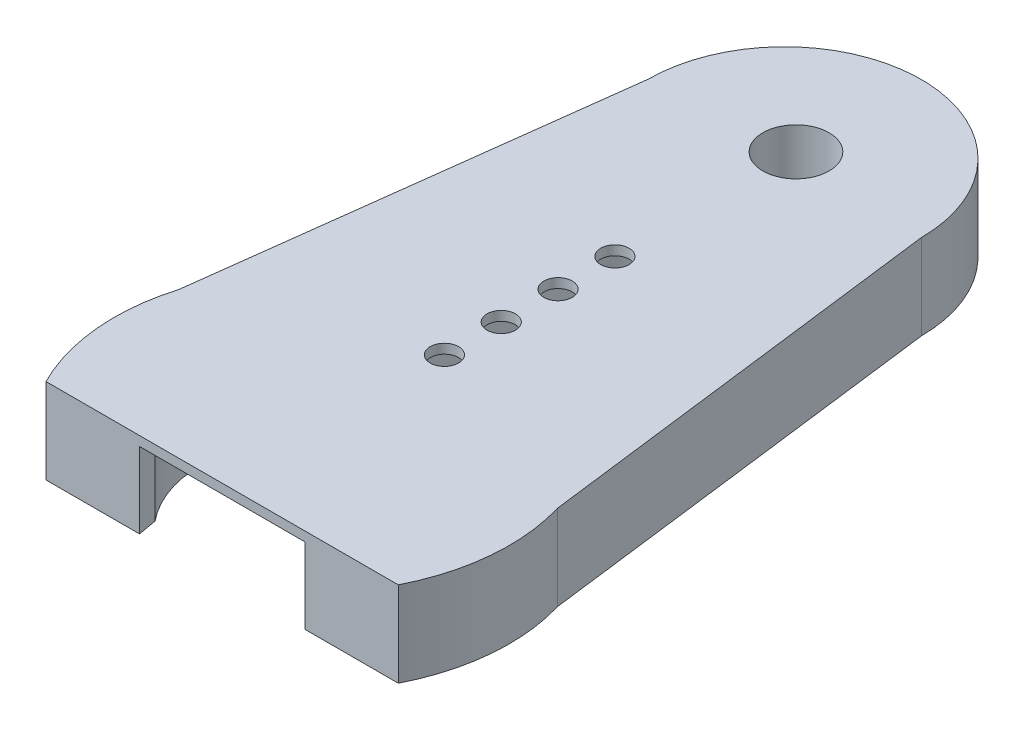
ISO-10303-21;
HEADER;
FILE_DESCRIPTION(('STEP AP214'),'2;1');
FILE_NAME('part.step','',(''),(''),'','','');
FILE_SCHEMA(('AUTOMOTIVE_DESIGN { 1 0 10303 214 1 1 1 1 }'));
ENDSEC;
DATA;
#1=APPLICATION_CONTEXT('core data for automotive mechanical design processes');
#2=APPLICATION_PROTOCOL_DEFINITION('international standard','automotive_design',2000,#1);
#3=PRODUCT_CONTEXT('',#1,'mechanical');
#4=PRODUCT('Part','Part','',(#3));
#5=PRODUCT_RELATED_PRODUCT_CATEGORY('part','',(#4));
#6=PRODUCT_DEFINITION_FORMATION('','',#4);
#7=PRODUCT_DEFINITION_CONTEXT('part definition',#1,'design');
#8=PRODUCT_DEFINITION('design','',#6,#7);
#9=PRODUCT_DEFINITION_SHAPE('','',#8);
#10=(LENGTH_UNIT() NAMED_UNIT(*) SI_UNIT(.MILLI.,.METRE.));
#11=(NAMED_UNIT(*) PLANE_ANGLE_UNIT() SI_UNIT($,.RADIAN.));
#12=(NAMED_UNIT(*) SI_UNIT($,.STERADIAN.) SOLID_ANGLE_UNIT());
#13=UNCERTAINTY_MEASURE_WITH_UNIT(LENGTH_MEASURE(1.E-05),#10,'distance_accuracy_value','');
#14=(GEOMETRIC_REPRESENTATION_CONTEXT(3) GLOBAL_UNCERTAINTY_ASSIGNED_CONTEXT((#13)) GLOBAL_UNIT_ASSIGNED_CONTEXT((#10,
#11,#12)) REPRESENTATION_CONTEXT('',''));
#15=CARTESIAN_POINT('',(0.,0.,0.));
#16=DIRECTION('',(0.,0.,1.));
#17=DIRECTION('',(1.,0.,0.));
#18=AXIS2_PLACEMENT_3D('',#15,#16,#17);
#19=CARTESIAN_POINT('',(0.,4.,0.));
#20=DIRECTION('',(0.,-1.,0.));
#21=DIRECTION('',(0.,0.,-1.));
#22=AXIS2_PLACEMENT_3D('',#19,#20,#21);
#23=CYLINDRICAL_SURFACE('',#22,10.4308233873136);
#24=CARTESIAN_POINT('',(0.,4.5,0.));
#25=DIRECTION('',(0.,1.,0.));
#26=DIRECTION('',(0.,0.,1.));
#27=AXIS2_PLACEMENT_3D('',#24,#25,#26);
#28=CIRCLE('',#27,10.4308233873136);
#29=CARTESIAN_POINT('',(9.29732628389508,4.5,4.72882654663102));
#30=VERTEX_POINT('',#29);
#31=CARTESIAN_POINT('',(9.99842815600638,4.5,-2.97212229669431));
#32=VERTEX_POINT('',#31);
#33=EDGE_CURVE('E277',#30,#32,#28,.T.);
#34=ORIENTED_EDGE('',*,*,#33,.F.);
#35=DIRECTION('',(0.,-1.,0.));
#36=VECTOR('',#35,1.);
#37=CARTESIAN_POINT('',(9.29732628389508,10.,4.72882654663102));
#38=LINE('',#37,#36);
#39=CARTESIAN_POINT('',(9.29732628389508,0.,4.72882654663102));
#40=VERTEX_POINT('',#39);
#41=EDGE_CURVE('E170',#30,#40,#38,.T.);
#42=ORIENTED_EDGE('',*,*,#41,.T.);
#43=CARTESIAN_POINT('',(0.,0.,0.));
#44=DIRECTION('',(0.,1.,0.));
#45=DIRECTION('',(0.,0.,1.));
#46=AXIS2_PLACEMENT_3D('',#43,#44,#45);
#47=CIRCLE('',#46,10.4308233873136);
#48=CARTESIAN_POINT('',(9.99842815600638,0.,-2.97212229669431));
#49=VERTEX_POINT('',#48);
#50=EDGE_CURVE('E187',#40,#49,#47,.T.);
#51=ORIENTED_EDGE('',*,*,#50,.T.);
#52=DIRECTION('',(0.,-1.,0.));
#53=VECTOR('',#52,1.);
#54=CARTESIAN_POINT('',(9.99842815600638,4.,-2.97212229669431));
#55=LINE('',#54,#53);
#56=EDGE_CURVE('E200',#32,#49,#55,.T.);
#57=ORIENTED_EDGE('',*,*,#56,.F.);
#58=EDGE_LOOP('',(#34,#42,#51,#57));
#59=FACE_BOUND('',#58,.T.);
#60=ADVANCED_FACE('F45',(#59),#23,.T.);
#61=CARTESIAN_POINT('',(0.,4.,0.));
#62=DIRECTION('',(0.,-1.,0.));
#63=DIRECTION('',(0.,0.,-1.));
#64=AXIS2_PLACEMENT_3D('',#61,#62,#63);
#65=CYLINDRICAL_SURFACE('',#64,5.875);
#66=DIRECTION('',(0.,-1.,0.));
#67=VECTOR('',#66,1.);
#68=CARTESIAN_POINT('',(-4.53330513002636,4.,3.73694656077347));
#69=LINE('',#68,#67);
#70=CARTESIAN_POINT('',(-4.53330513002636,4.,3.73694656077347));
#71=VERTEX_POINT('',#70);
#72=CARTESIAN_POINT('',(-4.53330513002636,0.,3.73694656077347));
#73=VERTEX_POINT('',#72);
#74=EDGE_CURVE('E263',#71,#73,#69,.T.);
#75=ORIENTED_EDGE('',*,*,#74,.T.);
#76=CARTESIAN_POINT('',(0.,0.,0.));
#77=DIRECTION('',(0.,1.,0.));
#78=DIRECTION('',(0.,0.,1.));
#79=AXIS2_PLACEMENT_3D('',#76,#77,#78);
#80=CIRCLE('',#79,5.875);
#81=CARTESIAN_POINT('',(-5.06775236702549,0.,-2.97212229669431));
#82=VERTEX_POINT('',#81);
#83=EDGE_CURVE('E322',#82,#73,#80,.T.);
#84=ORIENTED_EDGE('',*,*,#83,.F.);
#85=DIRECTION('',(0.,-1.,0.));
#86=VECTOR('',#85,1.);
#87=CARTESIAN_POINT('',(-5.06775236702549,4.,-2.97212229669431));
#88=LINE('',#87,#86);
#89=CARTESIAN_POINT('',(-5.06775236702549,4.,-2.97212229669431));
#90=VERTEX_POINT('',#89);
#91=EDGE_CURVE('E321',#90,#82,#88,.T.);
#92=ORIENTED_EDGE('',*,*,#91,.F.);
#93=CARTESIAN_POINT('',(0.,4.,0.));
#94=DIRECTION('',(0.,1.,0.));
#95=DIRECTION('',(0.,0.,1.));
#96=AXIS2_PLACEMENT_3D('',#93,#94,#95);
#97=CIRCLE('',#96,5.875);
#98=EDGE_CURVE('E286',#90,#71,#97,.T.);
#99=ORIENTED_EDGE('',*,*,#98,.T.);
#100=EDGE_LOOP('',(#75,#84,#92,#99));
#101=FACE_BOUND('',#100,.T.);
#102=ADVANCED_FACE('F418',(#101),#65,.F.);
#103=CARTESIAN_POINT('',(0.,0.,-24.9586700539253));
#104=DIRECTION('',(0.,-1.,0.));
#105=DIRECTION('',(0.,0.,-1.));
#106=AXIS2_PLACEMENT_3D('',#103,#104,#105);
#107=PLANE('',#106);
#108=CARTESIAN_POINT('',(0.,0.,-25.5637931319823));
#109=DIRECTION('',(0.,-1.,0.));
#110=DIRECTION('',(0.,0.,-1.));
#111=AXIS2_PLACEMENT_3D('',#108,#109,#110);
#112=CIRCLE('',#111,1.75);
#113=CARTESIAN_POINT('',(0.,0.,-27.3137931319823));
#114=VERTEX_POINT('',#113);
#115=EDGE_CURVE('E213',#114,#114,#112,.T.);
#116=ORIENTED_EDGE('',*,*,#115,.F.);
#117=EDGE_LOOP('',(#116));
#118=FACE_BOUND('',#117,.T.);
#119=DIRECTION('',(0.999999947121387,0.,-0.000325203358046759));
#120=VECTOR('',#119,1.);
#121=CARTESIAN_POINT('',(-9.29424865699371,0.,4.73487258955288));
#122=LINE('',#121,#120);
#123=CARTESIAN_POINT('',(-9.29424865699371,0.,4.73487258955288));
#124=VERTEX_POINT('',#123);
#125=CARTESIAN_POINT('',(-4.36020238089955,0.,4.73326802105029));
#126=VERTEX_POINT('',#125);
#127=EDGE_CURVE('E161',#124,#126,#122,.T.);
#128=ORIENTED_EDGE('',*,*,#127,.F.);
#129=CARTESIAN_POINT('',(-9.99842815600638,0.,-2.97212229669432));
#130=VERTEX_POINT('',#129);
#131=EDGE_CURVE('E176',#130,#124,#47,.T.);
#132=ORIENTED_EDGE('',*,*,#131,.F.);
#133=DIRECTION('',(-0.12507005769108,0.,0.992147912697068));
#134=VECTOR('',#133,1.);
#135=CARTESIAN_POINT('',(-7.22511055487982,0.,-24.9721222966943));
#136=LINE('',#135,#134);
#137=CARTESIAN_POINT('',(-7.22511055487982,0.,-24.9721222966943));
#138=VERTEX_POINT('',#137);
#139=EDGE_CURVE('E193',#138,#130,#136,.T.);
#140=ORIENTED_EDGE('',*,*,#139,.F.);
#141=CARTESIAN_POINT('',(0.,0.,-24.9586700539253));
#142=DIRECTION('',(0.,1.,0.));
#143=DIRECTION('',(0.,0.,-1.));
#144=AXIS2_PLACEMENT_3D('',#141,#142,#143);
#145=CIRCLE('',#144,7.22512307805697);
#146=CARTESIAN_POINT('',(7.22511055487983,0.,-24.9721222966943));
#147=VERTEX_POINT('',#146);
#148=EDGE_CURVE('E373',#147,#138,#145,.T.);
#149=ORIENTED_EDGE('',*,*,#148,.F.);
#150=DIRECTION('',(-0.12507005769108,0.,-0.992147912697068));
#151=VECTOR('',#150,1.);
#152=CARTESIAN_POINT('',(7.22511055487983,0.,-24.9721222966943));
#153=LINE('',#152,#151);
#154=EDGE_CURVE('E186',#49,#147,#153,.T.);
#155=ORIENTED_EDGE('',*,*,#154,.F.);
#156=ORIENTED_EDGE('',*,*,#50,.F.);
#157=CARTESIAN_POINT('',(4.36339532318432,0.,4.73043107763266));
#158=VERTEX_POINT('',#157);
#159=EDGE_CURVE('E180',#158,#40,#122,.T.);
#160=ORIENTED_EDGE('',*,*,#159,.F.);
#161=DIRECTION('',(-0.169432006625125,0.,0.985541878933099));
#162=VECTOR('',#161,1.);
#163=CARTESIAN_POINT('',(2.23762849809512,0.,17.0954633563768));
#164=LINE('',#163,#162);
#165=CARTESIAN_POINT('',(4.53442681190969,0.,3.73558542767188));
#166=VERTEX_POINT('',#165);
#167=EDGE_CURVE('E250',#166,#158,#164,.T.);
#168=ORIENTED_EDGE('',*,*,#167,.F.);
#169=CARTESIAN_POINT('',(5.06775236702549,0.,-2.97212229669431));
#170=VERTEX_POINT('',#169);
#171=EDGE_CURVE('E285',#166,#170,#80,.T.);
#172=ORIENTED_EDGE('',*,*,#171,.T.);
#173=DIRECTION('',(-0.174939494885749,0.,-0.984579185809409));
#174=VECTOR('',#173,1.);
#175=CARTESIAN_POINT('',(5.06775236702549,0.,-2.97212229669431));
#176=LINE('',#175,#174);
#177=CARTESIAN_POINT('',(2.96245100318559,0.,-14.8209955545409));
#178=VERTEX_POINT('',#177);
#179=EDGE_CURVE('E325',#170,#178,#176,.T.);
#180=ORIENTED_EDGE('',*,*,#179,.T.);
#181=CARTESIAN_POINT('',(2.96245100318559,0.,-14.8209955545409));
#182=CARTESIAN_POINT('',(2.89281031588237,0.,-16.996498505762));
#183=B_SPLINE_CURVE_WITH_KNOTS('',1,(#181,#182),.UNSPECIFIED.,.F.,.F.,(2,2),(0.,1.),.UNSPECIFIED.);
#184=CARTESIAN_POINT('',(2.89281031588237,0.,-16.996498505762));
#185=VERTEX_POINT('',#184);
#186=EDGE_CURVE('E329',#178,#185,#183,.T.);
#187=ORIENTED_EDGE('',*,*,#186,.T.);
#188=CARTESIAN_POINT('',(0.,0.,-17.0954633563768));
#189=DIRECTION('',(0.,1.,0.));
#190=DIRECTION('',(0.,0.,-1.));
#191=AXIS2_PLACEMENT_3D('',#188,#189,#190);
#192=CIRCLE('',#191,2.89450264559089);
#193=CARTESIAN_POINT('',(-2.89281031588237,0.,-16.996498505762));
#194=VERTEX_POINT('',#193);
#195=EDGE_CURVE('E335',#185,#194,#192,.T.);
#196=ORIENTED_EDGE('',*,*,#195,.T.);
#197=CARTESIAN_POINT('',(-2.89281031588237,0.,-16.996498505762));
#198=CARTESIAN_POINT('',(-3.00368119493964,0.,-14.8209955545409));
#199=B_SPLINE_CURVE_WITH_KNOTS('',1,(#197,#198),.UNSPECIFIED.,.F.,.F.,(2,2),(0.,1.),.UNSPECIFIED.);
#200=CARTESIAN_POINT('',(-3.00368119493964,0.,-14.8209955545409));
#201=VERTEX_POINT('',#200);
#202=EDGE_CURVE('E342',#194,#201,#199,.T.);
#203=ORIENTED_EDGE('',*,*,#202,.T.);
#204=DIRECTION('',(-0.171615362184589,0.,0.985164030739172));
#205=VECTOR('',#204,1.);
#206=CARTESIAN_POINT('',(-5.06775236702549,0.,-2.97212229669431));
#207=LINE('',#206,#205);
#208=EDGE_CURVE('E348',#201,#82,#207,.T.);
#209=ORIENTED_EDGE('',*,*,#208,.T.);
#210=ORIENTED_EDGE('',*,*,#83,.T.);
#211=DIRECTION('',(-0.171177472174614,0.,-0.98524021082166));
#212=VECTOR('',#211,1.);
#213=CARTESIAN_POINT('',(-4.53330513002636,0.,3.73694656077347));
#214=LINE('',#213,#212);
#215=EDGE_CURVE('E178',#126,#73,#214,.T.);
#216=ORIENTED_EDGE('',*,*,#215,.F.);
#217=EDGE_LOOP('',(#128,#132,#140,#149,#155,#156,#160,#168,#172,#180,#187,#196,#203,#209,#210,#216));
#218=FACE_BOUND('',#217,.T.);
#219=ADVANCED_FACE('F175',(#118,#218),#107,.T.);
#220=CARTESIAN_POINT('',(0.,4.,-24.9586700539253));
#221=DIRECTION('',(0.,-1.,0.));
#222=DIRECTION('',(0.,0.,-1.));
#223=AXIS2_PLACEMENT_3D('',#220,#221,#222);
#224=CYLINDRICAL_SURFACE('',#223,7.22512307805697);
#225=ORIENTED_EDGE('',*,*,#148,.T.);
#226=DIRECTION('',(0.,-1.,0.));
#227=VECTOR('',#226,1.);
#228=CARTESIAN_POINT('',(-7.22511055487982,4.,-24.9721222966943));
#229=LINE('',#228,#227);
#230=CARTESIAN_POINT('',(-7.22511055487982,4.5,-24.9721222966943));
#231=VERTEX_POINT('',#230);
#232=EDGE_CURVE('E55',#231,#138,#229,.T.);
#233=ORIENTED_EDGE('',*,*,#232,.F.);
#234=CARTESIAN_POINT('',(0.,4.5,-24.9586700539253));
#235=DIRECTION('',(0.,1.,0.));
#236=DIRECTION('',(0.,0.,-1.));
#237=AXIS2_PLACEMENT_3D('',#234,#235,#236);
#238=CIRCLE('',#237,7.22512307805697);
#239=CARTESIAN_POINT('',(7.22511055487983,4.5,-24.9721222966943));
#240=VERTEX_POINT('',#239);
#241=EDGE_CURVE('E267',#240,#231,#238,.T.);
#242=ORIENTED_EDGE('',*,*,#241,.F.);
#243=DIRECTION('',(0.,-1.,0.));
#244=VECTOR('',#243,1.);
#245=CARTESIAN_POINT('',(7.22511055487983,4.,-24.9721222966943));
#246=LINE('',#245,#244);
#247=EDGE_CURVE('E191',#240,#147,#246,.T.);
#248=ORIENTED_EDGE('',*,*,#247,.T.);
#249=EDGE_LOOP('',(#225,#233,#242,#248));
#250=FACE_BOUND('',#249,.T.);
#251=ADVANCED_FACE('F47',(#250),#224,.T.);
#252=CARTESIAN_POINT('',(-7.22511055487982,4.,-24.9721222966943));
#253=DIRECTION('',(0.992147912697069,0.,0.12507005769108));
#254=DIRECTION('',(0.12507005769108,0.,-0.992147912697069));
#255=AXIS2_PLACEMENT_3D('',#252,#253,#254);
#256=PLANE('',#255);
#257=ORIENTED_EDGE('',*,*,#139,.T.);
#258=DIRECTION('',(0.,-1.,0.));
#259=VECTOR('',#258,1.);
#260=CARTESIAN_POINT('',(-9.99842815600638,4.,-2.97212229669432));
#261=LINE('',#260,#259);
#262=CARTESIAN_POINT('',(-9.99842815600638,4.5,-2.97212229669432));
#263=VERTEX_POINT('',#262);
#264=EDGE_CURVE('E184',#263,#130,#261,.T.);
#265=ORIENTED_EDGE('',*,*,#264,.F.);
#266=DIRECTION('',(-0.12507005769108,0.,0.992147912697068));
#267=VECTOR('',#266,1.);
#268=CARTESIAN_POINT('',(-7.22511055487982,4.5,-24.9721222966943));
#269=LINE('',#268,#267);
#270=EDGE_CURVE('E273',#231,#263,#269,.T.);
#271=ORIENTED_EDGE('',*,*,#270,.F.);
#272=ORIENTED_EDGE('',*,*,#232,.T.);
#273=EDGE_LOOP('',(#257,#265,#271,#272));
#274=FACE_BOUND('',#273,.T.);
#275=ADVANCED_FACE('F380',(#274),#256,.F.);
#276=ORIENTED_EDGE('',*,*,#131,.T.);
#277=DIRECTION('',(0.,-1.,0.));
#278=VECTOR('',#277,1.);
#279=CARTESIAN_POINT('',(-9.29424865699371,10.,4.73487258955288));
#280=LINE('',#279,#278);
#281=CARTESIAN_POINT('',(-9.29424865699371,4.5,4.73487258955288));
#282=VERTEX_POINT('',#281);
#283=EDGE_CURVE('E158',#282,#124,#280,.T.);
#284=ORIENTED_EDGE('',*,*,#283,.F.);
#285=EDGE_CURVE('E278',#263,#282,#28,.T.);
#286=ORIENTED_EDGE('',*,*,#285,.F.);
#287=ORIENTED_EDGE('',*,*,#264,.T.);
#288=EDGE_LOOP('',(#276,#284,#286,#287));
#289=FACE_BOUND('',#288,.T.);
#290=ADVANCED_FACE('F183',(#289),#23,.T.);
#291=CARTESIAN_POINT('',(7.22511055487983,4.,-24.9721222966943));
#292=DIRECTION('',(-0.992147912697069,0.,0.12507005769108));
#293=DIRECTION('',(0.12507005769108,0.,0.992147912697069));
#294=AXIS2_PLACEMENT_3D('',#291,#292,#293);
#295=PLANE('',#294);
#296=ORIENTED_EDGE('',*,*,#154,.T.);
#297=ORIENTED_EDGE('',*,*,#247,.F.);
#298=DIRECTION('',(-0.12507005769108,0.,-0.992147912697068));
#299=VECTOR('',#298,1.);
#300=CARTESIAN_POINT('',(7.22511055487983,4.5,-24.9721222966943));
#301=LINE('',#300,#299);
#302=EDGE_CURVE('E281',#32,#240,#301,.T.);
#303=ORIENTED_EDGE('',*,*,#302,.F.);
#304=ORIENTED_EDGE('',*,*,#56,.T.);
#305=EDGE_LOOP('',(#296,#297,#303,#304));
#306=FACE_BOUND('',#305,.T.);
#307=ADVANCED_FACE('F386',(#306),#295,.F.);
#308=DIRECTION('',(0.,-1.,0.));
#309=VECTOR('',#308,1.);
#310=CARTESIAN_POINT('',(4.53442681190969,4.,3.73558542767188));
#311=LINE('',#310,#309);
#312=CARTESIAN_POINT('',(4.53442681190969,4.,3.73558542767188));
#313=VERTEX_POINT('',#312);
#314=EDGE_CURVE('E257',#313,#166,#311,.T.);
#315=ORIENTED_EDGE('',*,*,#314,.F.);
#316=CARTESIAN_POINT('',(5.06775236702549,4.,-2.97212229669431));
#317=VERTEX_POINT('',#316);
#318=EDGE_CURVE('E291',#313,#317,#97,.T.);
#319=ORIENTED_EDGE('',*,*,#318,.T.);
#320=DIRECTION('',(0.,-1.,0.));
#321=VECTOR('',#320,1.);
#322=CARTESIAN_POINT('',(5.06775236702549,4.,-2.97212229669431));
#323=LINE('',#322,#321);
#324=EDGE_CURVE('E370',#317,#170,#323,.T.);
#325=ORIENTED_EDGE('',*,*,#324,.T.);
#326=ORIENTED_EDGE('',*,*,#171,.F.);
#327=EDGE_LOOP('',(#315,#319,#325,#326));
#328=FACE_BOUND('',#327,.T.);
#329=ADVANCED_FACE('F403',(#328),#65,.F.);
#330=CARTESIAN_POINT('',(5.06775236702549,4.,-2.97212229669431));
#331=DIRECTION('',(-0.984579185809409,0.,0.174939494885749));
#332=DIRECTION('',(0.174939494885749,0.,0.984579185809409));
#333=AXIS2_PLACEMENT_3D('',#330,#331,#332);
#334=PLANE('',#333);
#335=ORIENTED_EDGE('',*,*,#179,.F.);
#336=ORIENTED_EDGE('',*,*,#324,.F.);
#337=DIRECTION('',(-0.174939494885749,0.,-0.984579185809409));
#338=VECTOR('',#337,1.);
#339=CARTESIAN_POINT('',(5.06775236702549,4.,-2.97212229669431));
#340=LINE('',#339,#338);
#341=CARTESIAN_POINT('',(2.96245100318559,4.,-14.8209955545409));
#342=VERTEX_POINT('',#341);
#343=EDGE_CURVE('E290',#317,#342,#340,.T.);
#344=ORIENTED_EDGE('',*,*,#343,.T.);
#345=DIRECTION('',(0.,-1.,0.));
#346=VECTOR('',#345,1.);
#347=CARTESIAN_POINT('',(2.96245100318559,4.,-14.8209955545409));
#348=LINE('',#347,#346);
#349=EDGE_CURVE('E367',#342,#178,#348,.T.);
#350=ORIENTED_EDGE('',*,*,#349,.T.);
#351=EDGE_LOOP('',(#335,#336,#344,#350));
#352=FACE_BOUND('',#351,.T.);
#353=ADVANCED_FACE('F410',(#352),#334,.T.);
#354=CARTESIAN_POINT('',(2.96245100318559,4.,-14.8209955545409));
#355=DIRECTION('',(-0.999488031629684,0.,0.0319949156745374));
#356=DIRECTION('',(0.0319949156745374,0.,0.999488031629684));
#357=AXIS2_PLACEMENT_3D('',#354,#355,#356);
#358=PLANE('',#357);
#359=ORIENTED_EDGE('',*,*,#186,.F.);
#360=ORIENTED_EDGE('',*,*,#349,.F.);
#361=CARTESIAN_POINT('',(2.96245100318559,4.,-14.8209955545409));
#362=CARTESIAN_POINT('',(2.89281031588237,4.,-16.996498505762));
#363=B_SPLINE_CURVE_WITH_KNOTS('',1,(#361,#362),.UNSPECIFIED.,.F.,.F.,(2,2),(0.,1.),.UNSPECIFIED.);
#364=CARTESIAN_POINT('',(2.89281031588237,4.,-16.996498505762));
#365=VERTEX_POINT('',#364);
#366=EDGE_CURVE('E295',#342,#365,#363,.T.);
#367=ORIENTED_EDGE('',*,*,#366,.T.);
#368=DIRECTION('',(0.,-1.,0.));
#369=VECTOR('',#368,1.);
#370=CARTESIAN_POINT('',(2.89281031588237,4.,-16.996498505762));
#371=LINE('',#370,#369);
#372=EDGE_CURVE('E364',#365,#185,#371,.T.);
#373=ORIENTED_EDGE('',*,*,#372,.T.);
#374=EDGE_LOOP('',(#359,#360,#367,#373));
#375=FACE_BOUND('',#374,.T.);
#376=ADVANCED_FACE('F432',(#375),#358,.T.);
#377=CARTESIAN_POINT('',(0.,4.,-17.0954633563768));
#378=DIRECTION('',(0.,-1.,0.));
#379=DIRECTION('',(0.,0.,-1.));
#380=AXIS2_PLACEMENT_3D('',#377,#378,#379);
#381=CYLINDRICAL_SURFACE('',#380,2.89450264559089);
#382=ORIENTED_EDGE('',*,*,#195,.F.);
#383=ORIENTED_EDGE('',*,*,#372,.F.);
#384=CARTESIAN_POINT('',(0.,4.,-17.0954633563768));
#385=DIRECTION('',(0.,1.,0.));
#386=DIRECTION('',(0.,0.,-1.));
#387=AXIS2_PLACEMENT_3D('',#384,#385,#386);
#388=CIRCLE('',#387,2.89450264559089);
#389=CARTESIAN_POINT('',(-2.89281031588237,4.,-16.996498505762));
#390=VERTEX_POINT('',#389);
#391=EDGE_CURVE('E301',#365,#390,#388,.T.);
#392=ORIENTED_EDGE('',*,*,#391,.T.);
#393=DIRECTION('',(0.,-1.,0.));
#394=VECTOR('',#393,1.);
#395=CARTESIAN_POINT('',(-2.89281031588237,4.,-16.996498505762));
#396=LINE('',#395,#394);
#397=EDGE_CURVE('E361',#390,#194,#396,.T.);
#398=ORIENTED_EDGE('',*,*,#397,.T.);
#399=EDGE_LOOP('',(#382,#383,#392,#398));
#400=FACE_BOUND('',#399,.T.);
#401=ADVANCED_FACE('F430',(#400),#381,.F.);
#402=CARTESIAN_POINT('',(-2.89281031588237,4.,-16.996498505762));
#403=DIRECTION('',(0.998703893597783,0.,0.0508972780473349));
#404=DIRECTION('',(0.0508972780473349,0.,-0.998703893597783));
#405=AXIS2_PLACEMENT_3D('',#402,#403,#404);
#406=PLANE('',#405);
#407=ORIENTED_EDGE('',*,*,#202,.F.);
#408=ORIENTED_EDGE('',*,*,#397,.F.);
#409=CARTESIAN_POINT('',(-2.89281031588237,4.,-16.996498505762));
#410=CARTESIAN_POINT('',(-3.00368119493964,4.,-14.8209955545409));
#411=B_SPLINE_CURVE_WITH_KNOTS('',1,(#409,#410),.UNSPECIFIED.,.F.,.F.,(2,2),(0.,1.),.UNSPECIFIED.);
#412=CARTESIAN_POINT('',(-3.00368119493964,4.,-14.8209955545409));
#413=VERTEX_POINT('',#412);
#414=EDGE_CURVE('E308',#390,#413,#411,.T.);
#415=ORIENTED_EDGE('',*,*,#414,.T.);
#416=DIRECTION('',(0.,-1.,0.));
#417=VECTOR('',#416,1.);
#418=CARTESIAN_POINT('',(-3.00368119493964,4.,-14.8209955545409));
#419=LINE('',#418,#417);
#420=EDGE_CURVE('E358',#413,#201,#419,.T.);
#421=ORIENTED_EDGE('',*,*,#420,.T.);
#422=EDGE_LOOP('',(#407,#408,#415,#421));
#423=FACE_BOUND('',#422,.T.);
#424=ADVANCED_FACE('F426',(#423),#406,.T.);
#425=CARTESIAN_POINT('',(-5.06775236702549,4.,-2.97212229669431));
#426=DIRECTION('',(0.985164030739172,0.,0.171615362184589));
#427=DIRECTION('',(0.171615362184589,0.,-0.985164030739172));
#428=AXIS2_PLACEMENT_3D('',#425,#426,#427);
#429=PLANE('',#428);
#430=ORIENTED_EDGE('',*,*,#208,.F.);
#431=ORIENTED_EDGE('',*,*,#420,.F.);
#432=DIRECTION('',(-0.171615362184589,0.,0.985164030739172));
#433=VECTOR('',#432,1.);
#434=CARTESIAN_POINT('',(-5.06775236702549,4.,-2.97212229669431));
#435=LINE('',#434,#433);
#436=EDGE_CURVE('E314',#413,#90,#435,.T.);
#437=ORIENTED_EDGE('',*,*,#436,.T.);
#438=ORIENTED_EDGE('',*,*,#91,.T.);
#439=EDGE_LOOP('',(#430,#431,#437,#438));
#440=FACE_BOUND('',#439,.T.);
#441=ADVANCED_FACE('F422',(#440),#429,.T.);
#442=CARTESIAN_POINT('',(0.,4.,-24.9586700539253));
#443=DIRECTION('',(0.,-1.,0.));
#444=DIRECTION('',(0.,0.,-1.));
#445=AXIS2_PLACEMENT_3D('',#442,#443,#444);
#446=PLANE('',#445);
#447=CARTESIAN_POINT('',(0.,4.,-16.0037931319823));
#448=DIRECTION('',(0.,-1.,0.));
#449=DIRECTION('',(0.,0.,-1.));
#450=AXIS2_PLACEMENT_3D('',#447,#448,#449);
#451=CIRCLE('',#450,0.750000000000001);
#452=CARTESIAN_POINT('',(0.,4.,-16.7537931319823));
#453=VERTEX_POINT('',#452);
#454=EDGE_CURVE('E219',#453,#453,#451,.T.);
#455=ORIENTED_EDGE('',*,*,#454,.F.);
#456=EDGE_LOOP('',(#455));
#457=FACE_BOUND('',#456,.T.);
#458=CARTESIAN_POINT('',(0.,4.,-13.0037931319823));
#459=DIRECTION('',(0.,-1.,0.));
#460=DIRECTION('',(0.,0.,-1.));
#461=AXIS2_PLACEMENT_3D('',#458,#459,#460);
#462=CIRCLE('',#461,0.750000000000001);
#463=CARTESIAN_POINT('',(0.,4.,-13.7537931319823));
#464=VERTEX_POINT('',#463);
#465=EDGE_CURVE('E623',#464,#464,#462,.T.);
#466=ORIENTED_EDGE('',*,*,#465,.F.);
#467=EDGE_LOOP('',(#466));
#468=FACE_BOUND('',#467,.T.);
#469=CARTESIAN_POINT('',(0.,4.,-10.0037931319823));
#470=DIRECTION('',(0.,-1.,0.));
#471=DIRECTION('',(0.,0.,-1.));
#472=AXIS2_PLACEMENT_3D('',#469,#470,#471);
#473=CIRCLE('',#472,0.750000000000001);
#474=CARTESIAN_POINT('',(0.,4.,-10.7537931319823));
#475=VERTEX_POINT('',#474);
#476=EDGE_CURVE('E627',#475,#475,#473,.T.);
#477=ORIENTED_EDGE('',*,*,#476,.F.);
#478=EDGE_LOOP('',(#477));
#479=FACE_BOUND('',#478,.T.);
#480=CARTESIAN_POINT('',(0.,4.,-7.00379313198229));
#481=DIRECTION('',(0.,-1.,0.));
#482=DIRECTION('',(0.,0.,-1.));
#483=AXIS2_PLACEMENT_3D('',#480,#481,#482);
#484=CIRCLE('',#483,0.75);
#485=CARTESIAN_POINT('',(0.,4.,-7.75379313198229));
#486=VERTEX_POINT('',#485);
#487=EDGE_CURVE('E237',#486,#486,#484,.T.);
#488=ORIENTED_EDGE('',*,*,#487,.F.);
#489=EDGE_LOOP('',(#488));
#490=FACE_BOUND('',#489,.T.);
#491=DIRECTION('',(0.999999947121387,0.,-0.000325203358046759));
#492=VECTOR('',#491,1.);
#493=CARTESIAN_POINT('',(0.00965545633540756,4.,4.73184692853229));
#494=LINE('',#493,#492);
#495=CARTESIAN_POINT('',(-4.36020238089955,4.,4.73326802105029));
#496=VERTEX_POINT('',#495);
#497=CARTESIAN_POINT('',(4.36339532318432,4.,4.73043107763266));
#498=VERTEX_POINT('',#497);
#499=EDGE_CURVE('E63',#496,#498,#494,.T.);
#500=ORIENTED_EDGE('',*,*,#499,.F.);
#501=DIRECTION('',(-0.171177472174614,0.,-0.98524021082166));
#502=VECTOR('',#501,1.);
#503=CARTESIAN_POINT('',(-4.53330513002636,4.,3.73694656077347));
#504=LINE('',#503,#502);
#505=EDGE_CURVE('E69',#496,#71,#504,.T.);
#506=ORIENTED_EDGE('',*,*,#505,.T.);
#507=ORIENTED_EDGE('',*,*,#98,.F.);
#508=ORIENTED_EDGE('',*,*,#436,.F.);
#509=ORIENTED_EDGE('',*,*,#414,.F.);
#510=ORIENTED_EDGE('',*,*,#391,.F.);
#511=ORIENTED_EDGE('',*,*,#366,.F.);
#512=ORIENTED_EDGE('',*,*,#343,.F.);
#513=ORIENTED_EDGE('',*,*,#318,.F.);
#514=DIRECTION('',(-0.169432006625125,0.,0.985541878933099));
#515=VECTOR('',#514,1.);
#516=CARTESIAN_POINT('',(2.23762849809512,4.,17.0954633563768));
#517=LINE('',#516,#515);
#518=EDGE_CURVE('E251',#313,#498,#517,.T.);
#519=ORIENTED_EDGE('',*,*,#518,.T.);
#520=EDGE_LOOP('',(#500,#506,#507,#508,#509,#510,#511,#512,#513,#519));
#521=FACE_BOUND('',#520,.T.);
#522=ADVANCED_FACE('F406',(#457,#468,#479,#490,#521),#446,.T.);
#523=CARTESIAN_POINT('',(0.,4.5,-24.9586700539253));
#524=DIRECTION('',(0.,-1.,0.));
#525=DIRECTION('',(0.,0.,-1.));
#526=AXIS2_PLACEMENT_3D('',#523,#524,#525);
#527=PLANE('',#526);
#528=CARTESIAN_POINT('',(0.,4.5,-16.0037931319823));
#529=DIRECTION('',(0.,-1.,0.));
#530=DIRECTION('',(0.,0.,-1.));
#531=AXIS2_PLACEMENT_3D('',#528,#529,#530);
#532=CIRCLE('',#531,0.750000000000001);
#533=CARTESIAN_POINT('',(0.,4.5,-16.7537931319823));
#534=VERTEX_POINT('',#533);
#535=EDGE_CURVE('E49',#534,#534,#532,.T.);
#536=ORIENTED_EDGE('',*,*,#535,.T.);
#537=EDGE_LOOP('',(#536));
#538=FACE_BOUND('',#537,.T.);
#539=CARTESIAN_POINT('',(0.,4.5,-13.0037931319823));
#540=DIRECTION('',(0.,-1.,0.));
#541=DIRECTION('',(0.,0.,-1.));
#542=AXIS2_PLACEMENT_3D('',#539,#540,#541);
#543=CIRCLE('',#542,0.750000000000001);
#544=CARTESIAN_POINT('',(0.,4.5,-13.7537931319823));
#545=VERTEX_POINT('',#544);
#546=EDGE_CURVE('E222',#545,#545,#543,.T.);
#547=ORIENTED_EDGE('',*,*,#546,.T.);
#548=EDGE_LOOP('',(#547));
#549=FACE_BOUND('',#548,.T.);
#550=CARTESIAN_POINT('',(0.,4.5,-10.0037931319823));
#551=DIRECTION('',(0.,-1.,0.));
#552=DIRECTION('',(0.,0.,-1.));
#553=AXIS2_PLACEMENT_3D('',#550,#551,#552);
#554=CIRCLE('',#553,0.750000000000001);
#555=CARTESIAN_POINT('',(0.,4.5,-10.7537931319823));
#556=VERTEX_POINT('',#555);
#557=EDGE_CURVE('E218',#556,#556,#554,.T.);
#558=ORIENTED_EDGE('',*,*,#557,.T.);
#559=EDGE_LOOP('',(#558));
#560=FACE_BOUND('',#559,.T.);
#561=CARTESIAN_POINT('',(0.,4.5,-7.00379313198229));
#562=DIRECTION('',(0.,-1.,0.));
#563=DIRECTION('',(0.,0.,-1.));
#564=AXIS2_PLACEMENT_3D('',#561,#562,#563);
#565=CIRCLE('',#564,0.75);
#566=CARTESIAN_POINT('',(0.,4.5,-7.75379313198229));
#567=VERTEX_POINT('',#566);
#568=EDGE_CURVE('E214',#567,#567,#565,.T.);
#569=ORIENTED_EDGE('',*,*,#568,.T.);
#570=EDGE_LOOP('',(#569));
#571=FACE_BOUND('',#570,.T.);
#572=CARTESIAN_POINT('',(0.,4.5,-25.5637931319823));
#573=DIRECTION('',(0.,-1.,0.));
#574=DIRECTION('',(0.,0.,-1.));
#575=AXIS2_PLACEMENT_3D('',#572,#573,#574);
#576=CIRCLE('',#575,1.75);
#577=CARTESIAN_POINT('',(0.,4.5,-27.3137931319823));
#578=VERTEX_POINT('',#577);
#579=EDGE_CURVE('E209',#578,#578,#576,.T.);
#580=ORIENTED_EDGE('',*,*,#579,.T.);
#581=EDGE_LOOP('',(#580));
#582=FACE_BOUND('',#581,.T.);
#583=ORIENTED_EDGE('',*,*,#285,.T.);
#584=DIRECTION('',(0.999999947121387,0.,-0.000325203358046759));
#585=VECTOR('',#584,1.);
#586=CARTESIAN_POINT('',(0.00965545633540756,4.5,4.73184692853229));
#587=LINE('',#586,#585);
#588=EDGE_CURVE('E164',#282,#30,#587,.T.);
#589=ORIENTED_EDGE('',*,*,#588,.T.);
#590=ORIENTED_EDGE('',*,*,#33,.T.);
#591=ORIENTED_EDGE('',*,*,#302,.T.);
#592=ORIENTED_EDGE('',*,*,#241,.T.);
#593=ORIENTED_EDGE('',*,*,#270,.T.);
#594=EDGE_LOOP('',(#583,#589,#590,#591,#592,#593));
#595=FACE_BOUND('',#594,.T.);
#596=ADVANCED_FACE('F391',(#538,#549,#560,#571,#582,#595),#527,.F.);
#597=CARTESIAN_POINT('',(-4.53330513002636,4.,3.73694656077347));
#598=DIRECTION('',(-0.98524021082166,0.,0.171177472174614));
#599=DIRECTION('',(0.171177472174614,0.,0.98524021082166));
#600=AXIS2_PLACEMENT_3D('',#597,#598,#599);
#601=PLANE('',#600);
#602=ORIENTED_EDGE('',*,*,#505,.F.);
#603=DIRECTION('',(0.,-1.,0.));
#604=VECTOR('',#603,1.);
#605=CARTESIAN_POINT('',(-4.36020238089955,4.,4.73326802105029));
#606=LINE('',#605,#604);
#607=EDGE_CURVE('E245',#496,#126,#606,.T.);
#608=ORIENTED_EDGE('',*,*,#607,.T.);
#609=ORIENTED_EDGE('',*,*,#215,.T.);
#610=ORIENTED_EDGE('',*,*,#74,.F.);
#611=EDGE_LOOP('',(#602,#608,#609,#610));
#612=FACE_BOUND('',#611,.T.);
#613=ADVANCED_FACE('F415',(#612),#601,.F.);
#614=CARTESIAN_POINT('',(2.23762849809512,4.,17.0954633563768));
#615=DIRECTION('',(0.985541878933099,0.,0.169432006625125));
#616=DIRECTION('',(0.169432006625125,0.,-0.985541878933099));
#617=AXIS2_PLACEMENT_3D('',#614,#615,#616);
#618=PLANE('',#617);
#619=ORIENTED_EDGE('',*,*,#167,.T.);
#620=DIRECTION('',(0.,1.,0.));
#621=VECTOR('',#620,1.);
#622=CARTESIAN_POINT('',(4.36339532318432,4.,4.73043107763266));
#623=LINE('',#622,#621);
#624=EDGE_CURVE('E11',#158,#498,#623,.T.);
#625=ORIENTED_EDGE('',*,*,#624,.T.);
#626=ORIENTED_EDGE('',*,*,#518,.F.);
#627=ORIENTED_EDGE('',*,*,#314,.T.);
#628=EDGE_LOOP('',(#619,#625,#626,#627));
#629=FACE_BOUND('',#628,.T.);
#630=ADVANCED_FACE('F413',(#629),#618,.F.);
#631=CARTESIAN_POINT('',(-9.29424865699371,10.,4.73487258955288));
#632=DIRECTION('',(-0.000325203358046759,0.,-0.999999947121387));
#633=DIRECTION('',(-0.999999947121387,0.,0.000325203358046759));
#634=AXIS2_PLACEMENT_3D('',#631,#632,#633);
#635=PLANE('',#634);
#636=ORIENTED_EDGE('',*,*,#283,.T.);
#637=ORIENTED_EDGE('',*,*,#127,.T.);
#638=ORIENTED_EDGE('',*,*,#607,.F.);
#639=ORIENTED_EDGE('',*,*,#499,.T.);
#640=ORIENTED_EDGE('',*,*,#624,.F.);
#641=ORIENTED_EDGE('',*,*,#159,.T.);
#642=ORIENTED_EDGE('',*,*,#41,.F.);
#643=ORIENTED_EDGE('',*,*,#588,.F.);
#644=EDGE_LOOP('',(#636,#637,#638,#639,#640,#641,#642,#643));
#645=FACE_BOUND('',#644,.T.);
#646=ADVANCED_FACE('F160',(#645),#635,.F.);
#647=CARTESIAN_POINT('',(0.,10.,-25.5637931319823));
#648=DIRECTION('',(0.,-1.,0.));
#649=DIRECTION('',(0.,0.,-1.));
#650=AXIS2_PLACEMENT_3D('',#647,#648,#649);
#651=CYLINDRICAL_SURFACE('',#650,1.75);
#652=ORIENTED_EDGE('',*,*,#115,.T.);
#653=EDGE_LOOP('',(#652));
#654=FACE_BOUND('',#653,.T.);
#655=ORIENTED_EDGE('',*,*,#579,.F.);
#656=EDGE_LOOP('',(#655));
#657=FACE_BOUND('',#656,.T.);
#658=ADVANCED_FACE('F547',(#654,#657),#651,.F.);
#659=CARTESIAN_POINT('',(0.,14.,-7.00379313198229));
#660=DIRECTION('',(0.,-1.,0.));
#661=DIRECTION('',(0.,0.,-1.));
#662=AXIS2_PLACEMENT_3D('',#659,#660,#661);
#663=CYLINDRICAL_SURFACE('',#662,0.75);
#664=ORIENTED_EDGE('',*,*,#487,.T.);
#665=EDGE_LOOP('',(#664));
#666=FACE_BOUND('',#665,.T.);
#667=ORIENTED_EDGE('',*,*,#568,.F.);
#668=EDGE_LOOP('',(#667));
#669=FACE_BOUND('',#668,.T.);
#670=ADVANCED_FACE('F542',(#666,#669),#663,.F.);
#671=CARTESIAN_POINT('',(0.,14.,-10.0037931319823));
#672=DIRECTION('',(0.,-1.,0.));
#673=DIRECTION('',(0.,0.,-1.));
#674=AXIS2_PLACEMENT_3D('',#671,#672,#673);
#675=CYLINDRICAL_SURFACE('',#674,0.750000000000001);
#676=ORIENTED_EDGE('',*,*,#476,.T.);
#677=EDGE_LOOP('',(#676));
#678=FACE_BOUND('',#677,.T.);
#679=ORIENTED_EDGE('',*,*,#557,.F.);
#680=EDGE_LOOP('',(#679));
#681=FACE_BOUND('',#680,.T.);
#682=ADVANCED_FACE('F546',(#678,#681),#675,.F.);
#683=CARTESIAN_POINT('',(0.,14.,-13.0037931319823));
#684=DIRECTION('',(0.,-1.,0.));
#685=DIRECTION('',(0.,0.,-1.));
#686=AXIS2_PLACEMENT_3D('',#683,#684,#685);
#687=CYLINDRICAL_SURFACE('',#686,0.750000000000001);
#688=ORIENTED_EDGE('',*,*,#465,.T.);
#689=EDGE_LOOP('',(#688));
#690=FACE_BOUND('',#689,.T.);
#691=ORIENTED_EDGE('',*,*,#546,.F.);
#692=EDGE_LOOP('',(#691));
#693=FACE_BOUND('',#692,.T.);
#694=ADVANCED_FACE('F557',(#690,#693),#687,.F.);
#695=CARTESIAN_POINT('',(0.,14.,-16.0037931319823));
#696=DIRECTION('',(0.,-1.,0.));
#697=DIRECTION('',(0.,0.,-1.));
#698=AXIS2_PLACEMENT_3D('',#695,#696,#697);
#699=CYLINDRICAL_SURFACE('',#698,0.750000000000001);
#700=ORIENTED_EDGE('',*,*,#454,.T.);
#701=EDGE_LOOP('',(#700));
#702=FACE_BOUND('',#701,.T.);
#703=ORIENTED_EDGE('',*,*,#535,.F.);
#704=EDGE_LOOP('',(#703));
#705=FACE_BOUND('',#704,.T.);
#706=ADVANCED_FACE('F566',(#702,#705),#699,.F.);
#707=CLOSED_SHELL('',(#60,#102,#219,#251,#275,#290,#307,#329,#353,#376,#401,#424,#441,#522,#596,
#613,#630,#646,#658,#670,#682,#694,#706));
#708=MANIFOLD_SOLID_BREP('B2',#707);
#709=ADVANCED_BREP_SHAPE_REPRESENTATION('',(#18,#708),#14);
#710=SHAPE_DEFINITION_REPRESENTATION(#9,#709);
ENDSEC;
END-ISO-10303-21;
